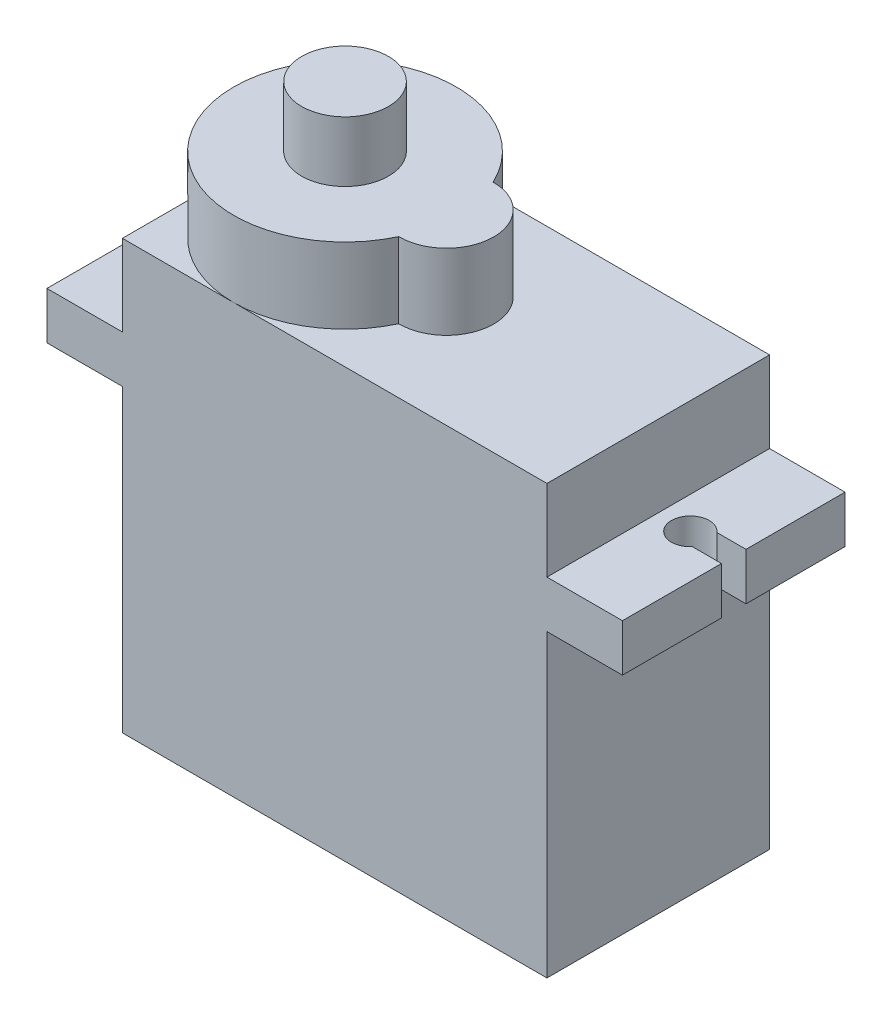
ISO-10303-21;
HEADER;
FILE_DESCRIPTION(('STEP AP214'),'2;1');
FILE_NAME('part.step','',(''),(''),'','','');
FILE_SCHEMA(('AUTOMOTIVE_DESIGN { 1 0 10303 214 1 1 1 1 }'));
ENDSEC;
DATA;
#1=APPLICATION_CONTEXT('core data for automotive mechanical design processes');
#2=APPLICATION_PROTOCOL_DEFINITION('international standard','automotive_design',2000,#1);
#3=PRODUCT_CONTEXT('',#1,'mechanical');
#4=PRODUCT('Part','Part','',(#3));
#5=PRODUCT_RELATED_PRODUCT_CATEGORY('part','',(#4));
#6=PRODUCT_DEFINITION_FORMATION('','',#4);
#7=PRODUCT_DEFINITION_CONTEXT('part definition',#1,'design');
#8=PRODUCT_DEFINITION('design','',#6,#7);
#9=PRODUCT_DEFINITION_SHAPE('','',#8);
#10=(LENGTH_UNIT() NAMED_UNIT(*) SI_UNIT(.MILLI.,.METRE.));
#11=(NAMED_UNIT(*) PLANE_ANGLE_UNIT() SI_UNIT($,.RADIAN.));
#12=(NAMED_UNIT(*) SI_UNIT($,.STERADIAN.) SOLID_ANGLE_UNIT());
#13=UNCERTAINTY_MEASURE_WITH_UNIT(LENGTH_MEASURE(1.E-05),#10,'distance_accuracy_value','');
#14=(GEOMETRIC_REPRESENTATION_CONTEXT(3) GLOBAL_UNCERTAINTY_ASSIGNED_CONTEXT((#13)) GLOBAL_UNIT_ASSIGNED_CONTEXT((#10,
#11,#12)) REPRESENTATION_CONTEXT('',''));
#15=CARTESIAN_POINT('',(0.,0.,0.));
#16=DIRECTION('',(0.,0.,1.));
#17=DIRECTION('',(1.,0.,0.));
#18=AXIS2_PLACEMENT_3D('',#15,#16,#17);
#19=CARTESIAN_POINT('',(20.5673002134826,0.,0.));
#20=DIRECTION('',(-1.,0.,0.));
#21=DIRECTION('',(0.,0.,1.));
#22=AXIS2_PLACEMENT_3D('',#19,#20,#21);
#23=PLANE('',#22);
#24=DIRECTION('',(0.,1.,0.));
#25=VECTOR('',#24,1.);
#26=CARTESIAN_POINT('',(20.5673002134826,-7.83236557610241,5.25000000000002));
#27=LINE('',#26,#25);
#28=CARTESIAN_POINT('',(20.5673002134826,8.0686344238976,5.25000000000002));
#29=VERTEX_POINT('',#28);
#30=CARTESIAN_POINT('',(20.5673002134826,10.5686344238976,5.25000000000002));
#31=VERTEX_POINT('',#30);
#32=EDGE_CURVE('E207',#29,#31,#27,.T.);
#33=ORIENTED_EDGE('',*,*,#32,.F.);
#34=DIRECTION('',(0.,0.,-1.));
#35=VECTOR('',#34,1.);
#36=CARTESIAN_POINT('',(20.5673002134826,8.06863442389759,11.8));
#37=LINE('',#36,#35);
#38=CARTESIAN_POINT('',(20.5673002134826,8.0686344238976,0.));
#39=VERTEX_POINT('',#38);
#40=EDGE_CURVE('E225',#29,#39,#37,.T.);
#41=ORIENTED_EDGE('',*,*,#40,.T.);
#42=DIRECTION('',(0.,1.,0.));
#43=VECTOR('',#42,1.);
#44=CARTESIAN_POINT('',(20.5673002134826,10.5686344238976,0.));
#45=LINE('',#44,#43);
#46=CARTESIAN_POINT('',(20.5673002134826,10.5686344238976,0.));
#47=VERTEX_POINT('',#46);
#48=EDGE_CURVE('E224',#39,#47,#45,.T.);
#49=ORIENTED_EDGE('',*,*,#48,.T.);
#50=DIRECTION('',(0.,0.,1.));
#51=VECTOR('',#50,1.);
#52=CARTESIAN_POINT('',(20.5673002134826,10.5686344238976,11.8));
#53=LINE('',#52,#51);
#54=EDGE_CURVE('E453',#47,#31,#53,.T.);
#55=ORIENTED_EDGE('',*,*,#54,.T.);
#56=EDGE_LOOP('',(#33,#41,#49,#55));
#57=FACE_BOUND('',#56,.T.);
#58=ADVANCED_FACE('F36',(#57),#23,.F.);
#59=CARTESIAN_POINT('',(-9.93269978651742,8.06863442389758,11.8));
#60=DIRECTION('',(0.,-1.,0.));
#61=DIRECTION('',(1.,0.,0.));
#62=AXIS2_PLACEMENT_3D('',#59,#60,#61);
#63=PLANE('',#62);
#64=ORIENTED_EDGE('',*,*,#40,.F.);
#65=DIRECTION('',(1.,0.,0.));
#66=VECTOR('',#65,1.);
#67=CARTESIAN_POINT('',(0.,8.06863442389759,5.25000000000002));
#68=LINE('',#67,#66);
#69=CARTESIAN_POINT('',(19.0272344211611,8.06863442389759,5.25000000000002));
#70=VERTEX_POINT('',#69);
#71=EDGE_CURVE('E218',#70,#29,#68,.T.);
#72=ORIENTED_EDGE('',*,*,#71,.F.);
#73=CARTESIAN_POINT('',(18.2673002134826,8.06863442389759,5.90000000000002));
#74=DIRECTION('',(0.,-1.,0.));
#75=DIRECTION('',(1.,0.,0.));
#76=AXIS2_PLACEMENT_3D('',#73,#74,#75);
#77=CIRCLE('',#76,1.);
#78=CARTESIAN_POINT('',(19.0272344211611,8.06863442389759,6.55000000000002));
#79=VERTEX_POINT('',#78);
#80=EDGE_CURVE('E217',#70,#79,#77,.F.);
#81=ORIENTED_EDGE('',*,*,#80,.T.);
#82=DIRECTION('',(1.,0.,0.));
#83=VECTOR('',#82,1.);
#84=CARTESIAN_POINT('',(0.,8.06863442389759,6.55000000000003));
#85=LINE('',#84,#83);
#86=CARTESIAN_POINT('',(20.5673002134826,8.0686344238976,6.55000000000002));
#87=VERTEX_POINT('',#86);
#88=EDGE_CURVE('E200',#79,#87,#85,.T.);
#89=ORIENTED_EDGE('',*,*,#88,.T.);
#90=CARTESIAN_POINT('',(20.5673002134826,8.06863442389759,11.8));
#91=VERTEX_POINT('',#90);
#92=EDGE_CURVE('E215',#91,#87,#37,.T.);
#93=ORIENTED_EDGE('',*,*,#92,.F.);
#94=DIRECTION('',(1.,0.,0.));
#95=VECTOR('',#94,1.);
#96=CARTESIAN_POINT('',(-9.93269978651742,8.06863442389758,11.8));
#97=LINE('',#96,#95);
#98=CARTESIAN_POINT('',(16.5673002134826,8.06863442389759,11.8));
#99=VERTEX_POINT('',#98);
#100=EDGE_CURVE('E257',#99,#91,#97,.T.);
#101=ORIENTED_EDGE('',*,*,#100,.F.);
#102=DIRECTION('',(0.,0.,1.));
#103=VECTOR('',#102,1.);
#104=CARTESIAN_POINT('',(16.5673002134826,8.06863442389759,11.8));
#105=LINE('',#104,#103);
#106=CARTESIAN_POINT('',(16.5673002134826,8.0686344238976,0.));
#107=VERTEX_POINT('',#106);
#108=EDGE_CURVE('E250',#107,#99,#105,.T.);
#109=ORIENTED_EDGE('',*,*,#108,.F.);
#110=DIRECTION('',(1.,0.,0.));
#111=VECTOR('',#110,1.);
#112=CARTESIAN_POINT('',(-9.93269978651742,8.06863442389759,0.));
#113=LINE('',#112,#111);
#114=EDGE_CURVE('E254',#107,#39,#113,.T.);
#115=ORIENTED_EDGE('',*,*,#114,.T.);
#116=EDGE_LOOP('',(#64,#72,#81,#89,#93,#101,#109,#115));
#117=FACE_BOUND('',#116,.T.);
#118=ADVANCED_FACE('F214',(#117),#63,.T.);
#119=CARTESIAN_POINT('',(-9.93269978651742,10.5686344238976,11.8));
#120=DIRECTION('',(0.,1.,0.));
#121=DIRECTION('',(-1.,0.,0.));
#122=AXIS2_PLACEMENT_3D('',#119,#120,#121);
#123=PLANE('',#122);
#124=CARTESIAN_POINT('',(18.2673002134826,10.5686344238976,5.90000000000002));
#125=DIRECTION('',(0.,1.,0.));
#126=DIRECTION('',(-1.,0.,0.));
#127=AXIS2_PLACEMENT_3D('',#124,#125,#126);
#128=CIRCLE('',#127,1.);
#129=CARTESIAN_POINT('',(19.0272344211611,10.5686344238976,5.25000000000002));
#130=VERTEX_POINT('',#129);
#131=CARTESIAN_POINT('',(19.0272344211611,10.5686344238976,6.55000000000002));
#132=VERTEX_POINT('',#131);
#133=EDGE_CURVE('E491',#130,#132,#128,.T.);
#134=ORIENTED_EDGE('',*,*,#133,.F.);
#135=DIRECTION('',(1.,0.,0.));
#136=VECTOR('',#135,1.);
#137=CARTESIAN_POINT('',(0.,10.5686344238976,5.25000000000002));
#138=LINE('',#137,#136);
#139=EDGE_CURVE('E53',#130,#31,#138,.T.);
#140=ORIENTED_EDGE('',*,*,#139,.T.);
#141=ORIENTED_EDGE('',*,*,#54,.F.);
#142=DIRECTION('',(1.,0.,0.));
#143=VECTOR('',#142,1.);
#144=CARTESIAN_POINT('',(-9.93269978651742,10.5686344238976,0.));
#145=LINE('',#144,#143);
#146=CARTESIAN_POINT('',(16.5673002134826,10.5686344238976,0.));
#147=VERTEX_POINT('',#146);
#148=EDGE_CURVE('E251',#147,#47,#145,.T.);
#149=ORIENTED_EDGE('',*,*,#148,.F.);
#150=DIRECTION('',(0.,0.,-1.));
#151=VECTOR('',#150,1.);
#152=CARTESIAN_POINT('',(16.5673002134826,10.5686344238976,11.8));
#153=LINE('',#152,#151);
#154=CARTESIAN_POINT('',(16.5673002134826,10.5686344238976,11.8));
#155=VERTEX_POINT('',#154);
#156=EDGE_CURVE('E265',#155,#147,#153,.T.);
#157=ORIENTED_EDGE('',*,*,#156,.F.);
#158=DIRECTION('',(1.,0.,0.));
#159=VECTOR('',#158,1.);
#160=CARTESIAN_POINT('',(-9.93269978651742,10.5686344238976,11.8));
#161=LINE('',#160,#159);
#162=CARTESIAN_POINT('',(20.5673002134826,10.5686344238976,11.8));
#163=VERTEX_POINT('',#162);
#164=EDGE_CURVE('E246',#155,#163,#161,.T.);
#165=ORIENTED_EDGE('',*,*,#164,.T.);
#166=CARTESIAN_POINT('',(20.5673002134826,10.5686344238976,6.55000000000002));
#167=VERTEX_POINT('',#166);
#168=EDGE_CURVE('E455',#167,#163,#53,.T.);
#169=ORIENTED_EDGE('',*,*,#168,.F.);
#170=DIRECTION('',(1.,0.,0.));
#171=VECTOR('',#170,1.);
#172=CARTESIAN_POINT('',(0.,10.5686344238976,6.55000000000003));
#173=LINE('',#172,#171);
#174=EDGE_CURVE('E203',#132,#167,#173,.T.);
#175=ORIENTED_EDGE('',*,*,#174,.F.);
#176=EDGE_LOOP('',(#134,#140,#141,#149,#157,#165,#169,#175));
#177=FACE_BOUND('',#176,.T.);
#178=ADVANCED_FACE('F391',(#177),#123,.T.);
#179=CARTESIAN_POINT('',(-9.93269978651742,0.,0.));
#180=DIRECTION('',(-1.,0.,0.));
#181=DIRECTION('',(0.,0.,1.));
#182=AXIS2_PLACEMENT_3D('',#179,#180,#181);
#183=PLANE('',#182);
#184=DIRECTION('',(0.,0.,1.));
#185=VECTOR('',#184,1.);
#186=CARTESIAN_POINT('',(-9.93269978651742,10.5686344238976,11.8));
#187=LINE('',#186,#185);
#188=CARTESIAN_POINT('',(-9.93269978651742,10.5686344238976,6.20000000000002));
#189=VERTEX_POINT('',#188);
#190=CARTESIAN_POINT('',(-9.93269978651742,10.5686344238976,11.8));
#191=VERTEX_POINT('',#190);
#192=EDGE_CURVE('E228',#189,#191,#187,.T.);
#193=ORIENTED_EDGE('',*,*,#192,.F.);
#194=DIRECTION('',(0.,1.,0.));
#195=VECTOR('',#194,1.);
#196=CARTESIAN_POINT('',(-9.93269978651742,-7.83236557610242,6.20000000000001));
#197=LINE('',#196,#195);
#198=CARTESIAN_POINT('',(-9.93269978651742,8.06863442389758,6.20000000000002));
#199=VERTEX_POINT('',#198);
#200=EDGE_CURVE('E433',#199,#189,#197,.T.);
#201=ORIENTED_EDGE('',*,*,#200,.F.);
#202=DIRECTION('',(0.,0.,-1.));
#203=VECTOR('',#202,1.);
#204=CARTESIAN_POINT('',(-9.93269978651742,8.06863442389758,11.8));
#205=LINE('',#204,#203);
#206=CARTESIAN_POINT('',(-9.93269978651742,8.06863442389758,11.8));
#207=VERTEX_POINT('',#206);
#208=EDGE_CURVE('E240',#207,#199,#205,.T.);
#209=ORIENTED_EDGE('',*,*,#208,.F.);
#210=DIRECTION('',(0.,-1.,0.));
#211=VECTOR('',#210,1.);
#212=CARTESIAN_POINT('',(-9.93269978651742,10.5686344238976,11.8));
#213=LINE('',#212,#211);
#214=EDGE_CURVE('E236',#191,#207,#213,.T.);
#215=ORIENTED_EDGE('',*,*,#214,.F.);
#216=EDGE_LOOP('',(#193,#201,#209,#215));
#217=FACE_BOUND('',#216,.T.);
#218=ADVANCED_FACE('F415',(#217),#183,.T.);
#219=CARTESIAN_POINT('',(-5.93269978651742,14.8686344238976,11.8));
#220=DIRECTION('',(1.,0.,0.));
#221=DIRECTION('',(0.,1.,0.));
#222=AXIS2_PLACEMENT_3D('',#219,#220,#221);
#223=PLANE('',#222);
#224=DIRECTION('',(0.,-1.,0.));
#225=VECTOR('',#224,1.);
#226=CARTESIAN_POINT('',(-5.93269978651742,14.8686344238976,0.));
#227=LINE('',#226,#225);
#228=CARTESIAN_POINT('',(-5.93269978651742,14.8686344238976,0.));
#229=VERTEX_POINT('',#228);
#230=CARTESIAN_POINT('',(-5.93269978651742,10.5686344238976,0.));
#231=VERTEX_POINT('',#230);
#232=EDGE_CURVE('E305',#229,#231,#227,.T.);
#233=ORIENTED_EDGE('',*,*,#232,.T.);
#234=DIRECTION('',(0.,0.,1.));
#235=VECTOR('',#234,1.);
#236=CARTESIAN_POINT('',(-5.93269978651742,10.5686344238976,11.8));
#237=LINE('',#236,#235);
#238=CARTESIAN_POINT('',(-5.93269978651742,10.5686344238976,11.8));
#239=VERTEX_POINT('',#238);
#240=EDGE_CURVE('E268',#231,#239,#237,.T.);
#241=ORIENTED_EDGE('',*,*,#240,.T.);
#242=DIRECTION('',(0.,-1.,0.));
#243=VECTOR('',#242,1.);
#244=CARTESIAN_POINT('',(-5.93269978651742,14.8686344238976,11.8));
#245=LINE('',#244,#243);
#246=CARTESIAN_POINT('',(-5.93269978651742,14.8686344238976,11.8));
#247=VERTEX_POINT('',#246);
#248=EDGE_CURVE('E290',#247,#239,#245,.T.);
#249=ORIENTED_EDGE('',*,*,#248,.F.);
#250=DIRECTION('',(0.,0.,-1.));
#251=VECTOR('',#250,1.);
#252=CARTESIAN_POINT('',(-5.93269978651742,14.8686344238976,11.8));
#253=LINE('',#252,#251);
#254=CARTESIAN_POINT('',(-5.93269978651742,14.8686344238976,5.9));
#255=VERTEX_POINT('',#254);
#256=EDGE_CURVE('E318',#247,#255,#253,.T.);
#257=ORIENTED_EDGE('',*,*,#256,.T.);
#258=EDGE_CURVE('E304',#255,#229,#253,.T.);
#259=ORIENTED_EDGE('',*,*,#258,.T.);
#260=EDGE_LOOP('',(#233,#241,#249,#257,#259));
#261=FACE_BOUND('',#260,.T.);
#262=ADVANCED_FACE('F354',(#261),#223,.F.);
#263=CARTESIAN_POINT('',(16.5673002134826,14.8686344238976,11.8));
#264=DIRECTION('',(-1.,0.,0.));
#265=DIRECTION('',(0.,-1.,0.));
#266=AXIS2_PLACEMENT_3D('',#263,#264,#265);
#267=PLANE('',#266);
#268=DIRECTION('',(0.,1.,0.));
#269=VECTOR('',#268,1.);
#270=CARTESIAN_POINT('',(16.5673002134826,14.8686344238976,11.8));
#271=LINE('',#270,#269);
#272=CARTESIAN_POINT('',(16.5673002134826,14.8686344238976,11.8));
#273=VERTEX_POINT('',#272);
#274=EDGE_CURVE('E296',#155,#273,#271,.T.);
#275=ORIENTED_EDGE('',*,*,#274,.F.);
#276=ORIENTED_EDGE('',*,*,#156,.T.);
#277=DIRECTION('',(0.,1.,0.));
#278=VECTOR('',#277,1.);
#279=CARTESIAN_POINT('',(16.5673002134826,14.8686344238976,0.));
#280=LINE('',#279,#278);
#281=CARTESIAN_POINT('',(16.5673002134826,14.8686344238976,0.));
#282=VERTEX_POINT('',#281);
#283=EDGE_CURVE('E310',#147,#282,#280,.T.);
#284=ORIENTED_EDGE('',*,*,#283,.T.);
#285=DIRECTION('',(0.,0.,-1.));
#286=VECTOR('',#285,1.);
#287=CARTESIAN_POINT('',(16.5673002134826,14.8686344238976,11.8));
#288=LINE('',#287,#286);
#289=EDGE_CURVE('E321',#273,#282,#288,.T.);
#290=ORIENTED_EDGE('',*,*,#289,.F.);
#291=EDGE_LOOP('',(#275,#276,#284,#290));
#292=FACE_BOUND('',#291,.T.);
#293=ADVANCED_FACE('F429',(#292),#267,.F.);
#294=CARTESIAN_POINT('',(-5.93269978651742,14.8686344238976,11.8));
#295=DIRECTION('',(0.,-1.,0.));
#296=DIRECTION('',(0.,0.,-1.));
#297=AXIS2_PLACEMENT_3D('',#294,#295,#296);
#298=PLANE('',#297);
#299=CARTESIAN_POINT('',(-0.0326997865174213,14.8686344238976,5.9));
#300=DIRECTION('',(0.,1.,0.));
#301=DIRECTION('',(0.,0.,1.));
#302=AXIS2_PLACEMENT_3D('',#299,#300,#301);
#303=CIRCLE('',#302,5.9);
#304=CARTESIAN_POINT('',(5.31155508996154,14.8686344238976,3.40021204594653));
#305=VERTEX_POINT('',#304);
#306=CARTESIAN_POINT('',(-0.0326997865174213,14.8686344238976,0.));
#307=VERTEX_POINT('',#306);
#308=EDGE_CURVE('E273',#305,#307,#303,.T.);
#309=ORIENTED_EDGE('',*,*,#308,.F.);
#310=CARTESIAN_POINT('',(5.3441155686,14.8686344238976,5.9));
#311=DIRECTION('',(0.,1.,0.));
#312=DIRECTION('',(0.,0.,1.));
#313=AXIS2_PLACEMENT_3D('',#310,#311,#312);
#314=CIRCLE('',#313,2.5);
#315=CARTESIAN_POINT('',(5.31155508996154,14.8686344238976,8.39978795405347));
#316=VERTEX_POINT('',#315);
#317=EDGE_CURVE('E278',#305,#316,#314,.F.);
#318=ORIENTED_EDGE('',*,*,#317,.T.);
#319=CARTESIAN_POINT('',(-0.0326997865174213,14.8686344238976,11.8));
#320=VERTEX_POINT('',#319);
#321=EDGE_CURVE('E283',#320,#316,#303,.T.);
#322=ORIENTED_EDGE('',*,*,#321,.F.);
#323=DIRECTION('',(-1.,0.,0.));
#324=VECTOR('',#323,1.);
#325=CARTESIAN_POINT('',(-5.93269978651742,14.8686344238976,11.8));
#326=LINE('',#325,#324);
#327=EDGE_CURVE('E301',#273,#320,#326,.T.);
#328=ORIENTED_EDGE('',*,*,#327,.F.);
#329=ORIENTED_EDGE('',*,*,#289,.T.);
#330=DIRECTION('',(-1.,0.,0.));
#331=VECTOR('',#330,1.);
#332=CARTESIAN_POINT('',(-5.93269978651742,14.8686344238976,0.));
#333=LINE('',#332,#331);
#334=EDGE_CURVE('E315',#282,#307,#333,.T.);
#335=ORIENTED_EDGE('',*,*,#334,.T.);
#336=EDGE_LOOP('',(#309,#318,#322,#328,#329,#335));
#337=FACE_BOUND('',#336,.T.);
#338=ADVANCED_FACE('F363',(#337),#298,.F.);
#339=EDGE_CURVE('E45',#307,#255,#303,.T.);
#340=ORIENTED_EDGE('',*,*,#339,.F.);
#341=EDGE_CURVE('E314',#307,#229,#333,.T.);
#342=ORIENTED_EDGE('',*,*,#341,.T.);
#343=ORIENTED_EDGE('',*,*,#258,.F.);
#344=EDGE_LOOP('',(#340,#342,#343));
#345=FACE_BOUND('',#344,.T.);
#346=ADVANCED_FACE('F351',(#345),#298,.F.);
#347=EDGE_CURVE('E334',#255,#320,#303,.T.);
#348=ORIENTED_EDGE('',*,*,#347,.F.);
#349=ORIENTED_EDGE('',*,*,#256,.F.);
#350=EDGE_CURVE('E300',#320,#247,#326,.T.);
#351=ORIENTED_EDGE('',*,*,#350,.F.);
#352=EDGE_LOOP('',(#348,#349,#351));
#353=FACE_BOUND('',#352,.T.);
#354=ADVANCED_FACE('F349',(#353),#298,.F.);
#355=CARTESIAN_POINT('',(-5.93269978651742,8.06863442389759,11.8));
#356=VERTEX_POINT('',#355);
#357=CARTESIAN_POINT('',(-5.93269978651742,-7.83136557610241,11.8));
#358=VERTEX_POINT('',#357);
#359=EDGE_CURVE('E294',#356,#358,#245,.T.);
#360=ORIENTED_EDGE('',*,*,#359,.F.);
#361=DIRECTION('',(0.,0.,-1.));
#362=VECTOR('',#361,1.);
#363=CARTESIAN_POINT('',(-5.93269978651742,8.06863442389758,11.8));
#364=LINE('',#363,#362);
#365=CARTESIAN_POINT('',(-5.93269978651742,8.06863442389759,0.));
#366=VERTEX_POINT('',#365);
#367=EDGE_CURVE('E262',#356,#366,#364,.T.);
#368=ORIENTED_EDGE('',*,*,#367,.T.);
#369=CARTESIAN_POINT('',(-5.93269978651742,-7.83136557610241,0.));
#370=VERTEX_POINT('',#369);
#371=EDGE_CURVE('E289',#366,#370,#227,.T.);
#372=ORIENTED_EDGE('',*,*,#371,.T.);
#373=DIRECTION('',(0.,0.,-1.));
#374=VECTOR('',#373,1.);
#375=CARTESIAN_POINT('',(-5.93269978651742,-7.83136557610241,11.8));
#376=LINE('',#375,#374);
#377=EDGE_CURVE('E40',#358,#370,#376,.T.);
#378=ORIENTED_EDGE('',*,*,#377,.F.);
#379=EDGE_LOOP('',(#360,#368,#372,#378));
#380=FACE_BOUND('',#379,.T.);
#381=ADVANCED_FACE('F38',(#380),#223,.F.);
#382=CARTESIAN_POINT('',(-5.93269978651742,-7.83136557610241,11.8));
#383=DIRECTION('',(0.,1.,0.));
#384=DIRECTION('',(0.,0.,1.));
#385=AXIS2_PLACEMENT_3D('',#382,#383,#384);
#386=PLANE('',#385);
#387=DIRECTION('',(1.,0.,0.));
#388=VECTOR('',#387,1.);
#389=CARTESIAN_POINT('',(-5.93269978651742,-7.83136557610241,0.));
#390=LINE('',#389,#388);
#391=CARTESIAN_POINT('',(16.5673002134826,-7.83136557610241,0.));
#392=VERTEX_POINT('',#391);
#393=EDGE_CURVE('E308',#370,#392,#390,.T.);
#394=ORIENTED_EDGE('',*,*,#393,.T.);
#395=DIRECTION('',(0.,0.,-1.));
#396=VECTOR('',#395,1.);
#397=CARTESIAN_POINT('',(16.5673002134826,-7.83136557610241,11.8));
#398=LINE('',#397,#396);
#399=CARTESIAN_POINT('',(16.5673002134826,-7.83136557610241,11.8));
#400=VERTEX_POINT('',#399);
#401=EDGE_CURVE('E323',#400,#392,#398,.T.);
#402=ORIENTED_EDGE('',*,*,#401,.F.);
#403=DIRECTION('',(1.,0.,0.));
#404=VECTOR('',#403,1.);
#405=CARTESIAN_POINT('',(-5.93269978651742,-7.83136557610241,11.8));
#406=LINE('',#405,#404);
#407=EDGE_CURVE('E293',#358,#400,#406,.T.);
#408=ORIENTED_EDGE('',*,*,#407,.F.);
#409=ORIENTED_EDGE('',*,*,#377,.T.);
#410=EDGE_LOOP('',(#394,#402,#408,#409));
#411=FACE_BOUND('',#410,.T.);
#412=ADVANCED_FACE('F482',(#411),#386,.F.);
#413=EDGE_CURVE('E311',#392,#107,#280,.T.);
#414=ORIENTED_EDGE('',*,*,#413,.T.);
#415=ORIENTED_EDGE('',*,*,#108,.T.);
#416=EDGE_CURVE('E297',#400,#99,#271,.T.);
#417=ORIENTED_EDGE('',*,*,#416,.F.);
#418=ORIENTED_EDGE('',*,*,#401,.T.);
#419=EDGE_LOOP('',(#414,#415,#417,#418));
#420=FACE_BOUND('',#419,.T.);
#421=ADVANCED_FACE('F483',(#420),#267,.F.);
#422=CARTESIAN_POINT('',(0.,0.,11.8));
#423=DIRECTION('',(0.,0.,1.));
#424=DIRECTION('',(1.,0.,0.));
#425=AXIS2_PLACEMENT_3D('',#422,#423,#424);
#426=PLANE('',#425);
#427=ORIENTED_EDGE('',*,*,#416,.T.);
#428=ORIENTED_EDGE('',*,*,#100,.T.);
#429=DIRECTION('',(0.,-1.,0.));
#430=VECTOR('',#429,1.);
#431=CARTESIAN_POINT('',(20.5673002134826,10.5686344238976,11.8));
#432=LINE('',#431,#430);
#433=EDGE_CURVE('E223',#163,#91,#432,.T.);
#434=ORIENTED_EDGE('',*,*,#433,.F.);
#435=ORIENTED_EDGE('',*,*,#164,.F.);
#436=ORIENTED_EDGE('',*,*,#274,.T.);
#437=ORIENTED_EDGE('',*,*,#327,.T.);
#438=ORIENTED_EDGE('',*,*,#350,.T.);
#439=ORIENTED_EDGE('',*,*,#248,.T.);
#440=EDGE_CURVE('E258',#191,#239,#161,.T.);
#441=ORIENTED_EDGE('',*,*,#440,.F.);
#442=ORIENTED_EDGE('',*,*,#214,.T.);
#443=EDGE_CURVE('E255',#207,#356,#97,.T.);
#444=ORIENTED_EDGE('',*,*,#443,.T.);
#445=ORIENTED_EDGE('',*,*,#359,.T.);
#446=ORIENTED_EDGE('',*,*,#407,.T.);
#447=EDGE_LOOP('',(#427,#428,#434,#435,#436,#437,#438,#439,#441,#442,#444,#445,#446));
#448=FACE_BOUND('',#447,.T.);
#449=ADVANCED_FACE('F357',(#448),#426,.T.);
#450=CARTESIAN_POINT('',(0.,0.,0.));
#451=DIRECTION('',(0.,0.,1.));
#452=DIRECTION('',(1.,0.,0.));
#453=AXIS2_PLACEMENT_3D('',#450,#451,#452);
#454=PLANE('',#453);
#455=ORIENTED_EDGE('',*,*,#371,.F.);
#456=CARTESIAN_POINT('',(-9.93269978651742,8.06863442389759,0.));
#457=VERTEX_POINT('',#456);
#458=EDGE_CURVE('E252',#457,#366,#113,.T.);
#459=ORIENTED_EDGE('',*,*,#458,.F.);
#460=DIRECTION('',(0.,1.,0.));
#461=VECTOR('',#460,1.);
#462=CARTESIAN_POINT('',(-9.93269978651742,10.5686344238976,0.));
#463=LINE('',#462,#461);
#464=CARTESIAN_POINT('',(-9.93269978651742,10.5686344238976,0.));
#465=VERTEX_POINT('',#464);
#466=EDGE_CURVE('E243',#457,#465,#463,.T.);
#467=ORIENTED_EDGE('',*,*,#466,.T.);
#468=EDGE_CURVE('E247',#465,#231,#145,.T.);
#469=ORIENTED_EDGE('',*,*,#468,.T.);
#470=ORIENTED_EDGE('',*,*,#232,.F.);
#471=ORIENTED_EDGE('',*,*,#341,.F.);
#472=ORIENTED_EDGE('',*,*,#334,.F.);
#473=ORIENTED_EDGE('',*,*,#283,.F.);
#474=ORIENTED_EDGE('',*,*,#148,.T.);
#475=ORIENTED_EDGE('',*,*,#48,.F.);
#476=ORIENTED_EDGE('',*,*,#114,.F.);
#477=ORIENTED_EDGE('',*,*,#413,.F.);
#478=ORIENTED_EDGE('',*,*,#393,.F.);
#479=EDGE_LOOP('',(#455,#459,#467,#469,#470,#471,#472,#473,#474,#475,#476,#477,#478));
#480=FACE_BOUND('',#479,.T.);
#481=ADVANCED_FACE('F477',(#480),#454,.F.);
#482=CARTESIAN_POINT('',(-0.0326997865174213,18.8686344238976,5.9));
#483=DIRECTION('',(0.,-1.,0.));
#484=DIRECTION('',(0.,0.,-1.));
#485=AXIS2_PLACEMENT_3D('',#482,#483,#484);
#486=CYLINDRICAL_SURFACE('',#485,5.9);
#487=ORIENTED_EDGE('',*,*,#308,.T.);
#488=ORIENTED_EDGE('',*,*,#339,.T.);
#489=ORIENTED_EDGE('',*,*,#347,.T.);
#490=ORIENTED_EDGE('',*,*,#321,.T.);
#491=DIRECTION('',(0.,-1.,0.));
#492=VECTOR('',#491,1.);
#493=CARTESIAN_POINT('',(5.31155508996154,18.8686344238976,8.39978795405347));
#494=LINE('',#493,#492);
#495=CARTESIAN_POINT('',(5.31155508996154,18.8686344238976,8.39978795405347));
#496=VERTEX_POINT('',#495);
#497=EDGE_CURVE('E287',#496,#316,#494,.T.);
#498=ORIENTED_EDGE('',*,*,#497,.F.);
#499=CARTESIAN_POINT('',(-0.0326997865174213,18.8686344238976,5.9));
#500=DIRECTION('',(0.,1.,0.));
#501=DIRECTION('',(0.,0.,1.));
#502=AXIS2_PLACEMENT_3D('',#499,#500,#501);
#503=CIRCLE('',#502,5.9);
#504=CARTESIAN_POINT('',(5.31155508996154,18.8686344238976,3.40021204594653));
#505=VERTEX_POINT('',#504);
#506=EDGE_CURVE('E275',#505,#496,#503,.T.);
#507=ORIENTED_EDGE('',*,*,#506,.F.);
#508=DIRECTION('',(0.,-1.,0.));
#509=VECTOR('',#508,1.);
#510=CARTESIAN_POINT('',(5.31155508996154,18.8686344238976,3.40021204594653));
#511=LINE('',#510,#509);
#512=EDGE_CURVE('E281',#505,#305,#511,.T.);
#513=ORIENTED_EDGE('',*,*,#512,.T.);
#514=EDGE_LOOP('',(#487,#488,#489,#490,#498,#507,#513));
#515=FACE_BOUND('',#514,.T.);
#516=ADVANCED_FACE('F340',(#515),#486,.T.);
#517=CARTESIAN_POINT('',(5.3441155686,18.8686344238976,5.9));
#518=DIRECTION('',(0.,-1.,0.));
#519=DIRECTION('',(0.,0.,-1.));
#520=AXIS2_PLACEMENT_3D('',#517,#518,#519);
#521=CYLINDRICAL_SURFACE('',#520,2.5);
#522=ORIENTED_EDGE('',*,*,#317,.F.);
#523=ORIENTED_EDGE('',*,*,#512,.F.);
#524=CARTESIAN_POINT('',(5.3441155686,18.8686344238976,5.9));
#525=DIRECTION('',(0.,1.,0.));
#526=DIRECTION('',(0.,0.,1.));
#527=AXIS2_PLACEMENT_3D('',#524,#525,#526);
#528=CIRCLE('',#527,2.5);
#529=EDGE_CURVE('E277',#505,#496,#528,.F.);
#530=ORIENTED_EDGE('',*,*,#529,.T.);
#531=ORIENTED_EDGE('',*,*,#497,.T.);
#532=EDGE_LOOP('',(#522,#523,#530,#531));
#533=FACE_BOUND('',#532,.T.);
#534=ADVANCED_FACE('F367',(#533),#521,.T.);
#535=CARTESIAN_POINT('',(0.,18.8686344238976,0.));
#536=DIRECTION('',(0.,1.,0.));
#537=DIRECTION('',(0.,0.,1.));
#538=AXIS2_PLACEMENT_3D('',#535,#536,#537);
#539=PLANE('',#538);
#540=CARTESIAN_POINT('',(-0.0326997865174007,18.8686344238976,5.9));
#541=DIRECTION('',(0.,1.,0.));
#542=DIRECTION('',(0.,0.,1.));
#543=AXIS2_PLACEMENT_3D('',#540,#541,#542);
#544=CIRCLE('',#543,2.3);
#545=CARTESIAN_POINT('',(-0.0326997865174007,18.8686344238976,8.2));
#546=VERTEX_POINT('',#545);
#547=EDGE_CURVE('E11',#546,#546,#544,.T.);
#548=ORIENTED_EDGE('',*,*,#547,.F.);
#549=EDGE_LOOP('',(#548));
#550=FACE_BOUND('',#549,.T.);
#551=ORIENTED_EDGE('',*,*,#506,.T.);
#552=ORIENTED_EDGE('',*,*,#529,.F.);
#553=EDGE_LOOP('',(#551,#552));
#554=FACE_BOUND('',#553,.T.);
#555=ADVANCED_FACE('F371',(#550,#554),#539,.T.);
#556=CARTESIAN_POINT('',(-0.0326997865174007,22.0686344238976,5.9));
#557=DIRECTION('',(0.,-1.,0.));
#558=DIRECTION('',(0.,0.,-1.));
#559=AXIS2_PLACEMENT_3D('',#556,#557,#558);
#560=CYLINDRICAL_SURFACE('',#559,2.3);
#561=CARTESIAN_POINT('',(-0.0326997865174007,22.0686344238976,5.9));
#562=DIRECTION('',(0.,1.,0.));
#563=DIRECTION('',(0.,0.,1.));
#564=AXIS2_PLACEMENT_3D('',#561,#562,#563);
#565=CIRCLE('',#564,2.3);
#566=CARTESIAN_POINT('',(-0.0326997865174007,22.0686344238976,8.2));
#567=VERTEX_POINT('',#566);
#568=EDGE_CURVE('E271',#567,#567,#565,.T.);
#569=ORIENTED_EDGE('',*,*,#568,.F.);
#570=EDGE_LOOP('',(#569));
#571=FACE_BOUND('',#570,.T.);
#572=ORIENTED_EDGE('',*,*,#547,.T.);
#573=EDGE_LOOP('',(#572));
#574=FACE_BOUND('',#573,.T.);
#575=ADVANCED_FACE('F373',(#571,#574),#560,.T.);
#576=CARTESIAN_POINT('',(-0.0326997865174007,22.0686344238976,5.9));
#577=DIRECTION('',(0.,1.,0.));
#578=DIRECTION('',(0.,0.,1.));
#579=AXIS2_PLACEMENT_3D('',#576,#577,#578);
#580=PLANE('',#579);
#581=ORIENTED_EDGE('',*,*,#568,.T.);
#582=EDGE_LOOP('',(#581));
#583=FACE_BOUND('',#582,.T.);
#584=ADVANCED_FACE('F380',(#583),#580,.T.);
#585=ORIENTED_EDGE('',*,*,#92,.T.);
#586=DIRECTION('',(0.,1.,0.));
#587=VECTOR('',#586,1.);
#588=CARTESIAN_POINT('',(20.5673002134826,-7.83236557610241,6.55000000000001));
#589=LINE('',#588,#587);
#590=EDGE_CURVE('E197',#87,#167,#589,.T.);
#591=ORIENTED_EDGE('',*,*,#590,.T.);
#592=ORIENTED_EDGE('',*,*,#168,.T.);
#593=ORIENTED_EDGE('',*,*,#433,.T.);
#594=EDGE_LOOP('',(#585,#591,#592,#593));
#595=FACE_BOUND('',#594,.T.);
#596=ADVANCED_FACE('F221',(#595),#23,.F.);
#597=DIRECTION('',(-1.,0.,0.));
#598=VECTOR('',#597,1.);
#599=CARTESIAN_POINT('',(-8.39263399419596,10.5686344238976,4.90000000000002));
#600=LINE('',#599,#598);
#601=CARTESIAN_POINT('',(-8.39263399419596,10.5686344238976,4.90000000000002));
#602=VERTEX_POINT('',#601);
#603=CARTESIAN_POINT('',(-9.93269978651742,10.5686344238976,4.90000000000002));
#604=VERTEX_POINT('',#603);
#605=EDGE_CURVE('E441',#602,#604,#600,.T.);
#606=ORIENTED_EDGE('',*,*,#605,.F.);
#607=CARTESIAN_POINT('',(-7.63269978651742,10.5686344238976,5.55000000000002));
#608=DIRECTION('',(0.,-1.,0.));
#609=DIRECTION('',(1.,0.,0.));
#610=AXIS2_PLACEMENT_3D('',#607,#608,#609);
#611=CIRCLE('',#610,1.);
#612=CARTESIAN_POINT('',(-8.39263399419596,10.5686344238976,6.20000000000002));
#613=VERTEX_POINT('',#612);
#614=EDGE_CURVE('E440',#602,#613,#611,.T.);
#615=ORIENTED_EDGE('',*,*,#614,.T.);
#616=DIRECTION('',(-1.,0.,0.));
#617=VECTOR('',#616,1.);
#618=CARTESIAN_POINT('',(-8.39263399419596,10.5686344238976,6.20000000000002));
#619=LINE('',#618,#617);
#620=EDGE_CURVE('E438',#613,#189,#619,.T.);
#621=ORIENTED_EDGE('',*,*,#620,.T.);
#622=ORIENTED_EDGE('',*,*,#192,.T.);
#623=ORIENTED_EDGE('',*,*,#440,.T.);
#624=ORIENTED_EDGE('',*,*,#240,.F.);
#625=ORIENTED_EDGE('',*,*,#468,.F.);
#626=EDGE_CURVE('E233',#465,#604,#187,.T.);
#627=ORIENTED_EDGE('',*,*,#626,.T.);
#628=EDGE_LOOP('',(#606,#615,#621,#622,#623,#624,#625,#627));
#629=FACE_BOUND('',#628,.T.);
#630=ADVANCED_FACE('F398',(#629),#123,.T.);
#631=DIRECTION('',(-1.,0.,0.));
#632=VECTOR('',#631,1.);
#633=CARTESIAN_POINT('',(-8.39263399419596,8.06863442389759,4.90000000000002));
#634=LINE('',#633,#632);
#635=CARTESIAN_POINT('',(-8.39263399419596,8.06863442389759,4.90000000000001));
#636=VERTEX_POINT('',#635);
#637=CARTESIAN_POINT('',(-9.93269978651742,8.06863442389758,4.90000000000001));
#638=VERTEX_POINT('',#637);
#639=EDGE_CURVE('E443',#636,#638,#634,.T.);
#640=ORIENTED_EDGE('',*,*,#639,.T.);
#641=EDGE_CURVE('E239',#638,#457,#205,.T.);
#642=ORIENTED_EDGE('',*,*,#641,.T.);
#643=ORIENTED_EDGE('',*,*,#458,.T.);
#644=ORIENTED_EDGE('',*,*,#367,.F.);
#645=ORIENTED_EDGE('',*,*,#443,.F.);
#646=ORIENTED_EDGE('',*,*,#208,.T.);
#647=DIRECTION('',(-1.,0.,0.));
#648=VECTOR('',#647,1.);
#649=CARTESIAN_POINT('',(-8.39263399419596,8.06863442389758,6.20000000000002));
#650=LINE('',#649,#648);
#651=CARTESIAN_POINT('',(-8.39263399419595,8.06863442389758,6.20000000000002));
#652=VERTEX_POINT('',#651);
#653=EDGE_CURVE('E61',#652,#199,#650,.T.);
#654=ORIENTED_EDGE('',*,*,#653,.F.);
#655=CARTESIAN_POINT('',(-7.63269978651742,8.06863442389759,5.55000000000002));
#656=DIRECTION('',(0.,-1.,0.));
#657=DIRECTION('',(1.,0.,0.));
#658=AXIS2_PLACEMENT_3D('',#655,#656,#657);
#659=CIRCLE('',#658,1.);
#660=EDGE_CURVE('E451',#636,#652,#659,.T.);
#661=ORIENTED_EDGE('',*,*,#660,.F.);
#662=EDGE_LOOP('',(#640,#642,#643,#644,#645,#646,#654,#661));
#663=FACE_BOUND('',#662,.T.);
#664=ADVANCED_FACE('F393',(#663),#63,.T.);
#665=DIRECTION('',(0.,1.,0.));
#666=VECTOR('',#665,1.);
#667=CARTESIAN_POINT('',(-9.93269978651742,-7.83236557610242,4.90000000000001));
#668=LINE('',#667,#666);
#669=EDGE_CURVE('E445',#638,#604,#668,.T.);
#670=ORIENTED_EDGE('',*,*,#669,.T.);
#671=ORIENTED_EDGE('',*,*,#626,.F.);
#672=ORIENTED_EDGE('',*,*,#466,.F.);
#673=ORIENTED_EDGE('',*,*,#641,.F.);
#674=EDGE_LOOP('',(#670,#671,#672,#673));
#675=FACE_BOUND('',#674,.T.);
#676=ADVANCED_FACE('F410',(#675),#183,.T.);
#677=CARTESIAN_POINT('',(-8.39263399419595,-7.83236557610242,4.90000000000001));
#678=DIRECTION('',(0.,0.,-1.));
#679=DIRECTION('',(0.,1.,0.));
#680=AXIS2_PLACEMENT_3D('',#677,#678,#679);
#681=PLANE('',#680);
#682=DIRECTION('',(0.,1.,0.));
#683=VECTOR('',#682,1.);
#684=CARTESIAN_POINT('',(-8.39263399419595,-7.83236557610242,4.90000000000001));
#685=LINE('',#684,#683);
#686=EDGE_CURVE('E467',#636,#602,#685,.T.);
#687=ORIENTED_EDGE('',*,*,#686,.T.);
#688=ORIENTED_EDGE('',*,*,#605,.T.);
#689=ORIENTED_EDGE('',*,*,#669,.F.);
#690=ORIENTED_EDGE('',*,*,#639,.F.);
#691=EDGE_LOOP('',(#687,#688,#689,#690));
#692=FACE_BOUND('',#691,.T.);
#693=ADVANCED_FACE('F413',(#692),#681,.F.);
#694=CARTESIAN_POINT('',(-7.63269978651742,-7.83236557610242,5.55000000000001));
#695=DIRECTION('',(0.,1.,0.));
#696=DIRECTION('',(-1.,0.,0.));
#697=AXIS2_PLACEMENT_3D('',#694,#695,#696);
#698=CYLINDRICAL_SURFACE('',#697,1.);
#699=ORIENTED_EDGE('',*,*,#660,.T.);
#700=DIRECTION('',(0.,1.,0.));
#701=VECTOR('',#700,1.);
#702=CARTESIAN_POINT('',(-8.39263399419595,-7.83236557610242,6.20000000000002));
#703=LINE('',#702,#701);
#704=EDGE_CURVE('E466',#652,#613,#703,.T.);
#705=ORIENTED_EDGE('',*,*,#704,.T.);
#706=ORIENTED_EDGE('',*,*,#614,.F.);
#707=ORIENTED_EDGE('',*,*,#686,.F.);
#708=EDGE_LOOP('',(#699,#705,#706,#707));
#709=FACE_BOUND('',#708,.T.);
#710=ADVANCED_FACE('F419',(#709),#698,.F.);
#711=CARTESIAN_POINT('',(-8.39263399419595,-7.83236557610242,6.20000000000002));
#712=DIRECTION('',(0.,0.,-1.));
#713=DIRECTION('',(-1.,0.,0.));
#714=AXIS2_PLACEMENT_3D('',#711,#712,#713);
#715=PLANE('',#714);
#716=ORIENTED_EDGE('',*,*,#653,.T.);
#717=ORIENTED_EDGE('',*,*,#200,.T.);
#718=ORIENTED_EDGE('',*,*,#620,.F.);
#719=ORIENTED_EDGE('',*,*,#704,.F.);
#720=EDGE_LOOP('',(#716,#717,#718,#719));
#721=FACE_BOUND('',#720,.T.);
#722=ADVANCED_FACE('F500',(#721),#715,.T.);
#723=CARTESIAN_POINT('',(0.,-7.83236557610241,5.25000000000002));
#724=DIRECTION('',(0.,0.,1.));
#725=DIRECTION('',(0.,-1.,0.));
#726=AXIS2_PLACEMENT_3D('',#723,#724,#725);
#727=PLANE('',#726);
#728=ORIENTED_EDGE('',*,*,#71,.T.);
#729=ORIENTED_EDGE('',*,*,#32,.T.);
#730=ORIENTED_EDGE('',*,*,#139,.F.);
#731=DIRECTION('',(0.,1.,0.));
#732=VECTOR('',#731,1.);
#733=CARTESIAN_POINT('',(19.0272344211611,-7.83236557610241,5.25000000000002));
#734=LINE('',#733,#732);
#735=EDGE_CURVE('E462',#70,#130,#734,.T.);
#736=ORIENTED_EDGE('',*,*,#735,.F.);
#737=EDGE_LOOP('',(#728,#729,#730,#736));
#738=FACE_BOUND('',#737,.T.);
#739=ADVANCED_FACE('F498',(#738),#727,.T.);
#740=CARTESIAN_POINT('',(0.,-7.83236557610241,6.55000000000003));
#741=DIRECTION('',(0.,0.,1.));
#742=DIRECTION('',(1.,0.,0.));
#743=AXIS2_PLACEMENT_3D('',#740,#741,#742);
#744=PLANE('',#743);
#745=DIRECTION('',(0.,1.,0.));
#746=VECTOR('',#745,1.);
#747=CARTESIAN_POINT('',(19.0272344211611,-7.83236557610241,6.55000000000002));
#748=LINE('',#747,#746);
#749=EDGE_CURVE('E208',#79,#132,#748,.T.);
#750=ORIENTED_EDGE('',*,*,#749,.T.);
#751=ORIENTED_EDGE('',*,*,#174,.T.);
#752=ORIENTED_EDGE('',*,*,#590,.F.);
#753=ORIENTED_EDGE('',*,*,#88,.F.);
#754=EDGE_LOOP('',(#750,#751,#752,#753));
#755=FACE_BOUND('',#754,.T.);
#756=ADVANCED_FACE('F199',(#755),#744,.F.);
#757=CARTESIAN_POINT('',(18.2673002134826,-7.83236557610241,5.90000000000002));
#758=DIRECTION('',(0.,1.,0.));
#759=DIRECTION('',(-1.,0.,0.));
#760=AXIS2_PLACEMENT_3D('',#757,#758,#759);
#761=CYLINDRICAL_SURFACE('',#760,1.);
#762=ORIENTED_EDGE('',*,*,#735,.T.);
#763=ORIENTED_EDGE('',*,*,#133,.T.);
#764=ORIENTED_EDGE('',*,*,#749,.F.);
#765=ORIENTED_EDGE('',*,*,#80,.F.);
#766=EDGE_LOOP('',(#762,#763,#764,#765));
#767=FACE_BOUND('',#766,.T.);
#768=ADVANCED_FACE('F497',(#767),#761,.F.);
#769=CLOSED_SHELL('',(#58,#118,#178,#218,#262,#293,#338,#346,#354,#381,#412,#421,#449,#481,#516,
#534,#555,#575,#584,#596,#630,#664,#676,#693,#710,#722,#739,#756,#768));
#770=MANIFOLD_SOLID_BREP('B2',#769);
#771=ADVANCED_BREP_SHAPE_REPRESENTATION('',(#18,#770),#14);
#772=SHAPE_DEFINITION_REPRESENTATION(#9,#771);
ENDSEC;
END-ISO-10303-21;
